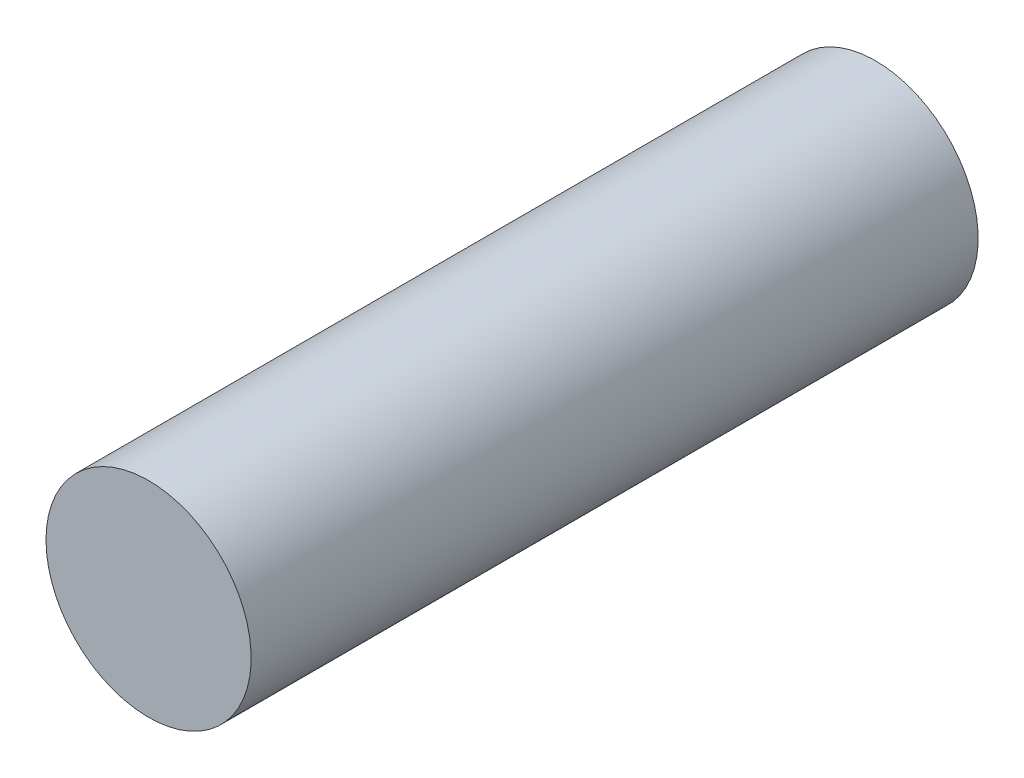
ISO-10303-21;
HEADER;
FILE_DESCRIPTION(('STEP AP214'),'2;1');
FILE_NAME('part.step','',(''),(''),'','','');
FILE_SCHEMA(('AUTOMOTIVE_DESIGN { 1 0 10303 214 1 1 1 1 }'));
ENDSEC;
DATA;
#1=APPLICATION_CONTEXT('core data for automotive mechanical design processes');
#2=APPLICATION_PROTOCOL_DEFINITION('international standard','automotive_design',2000,#1);
#3=PRODUCT_CONTEXT('',#1,'mechanical');
#4=PRODUCT('Part','Part','',(#3));
#5=PRODUCT_RELATED_PRODUCT_CATEGORY('part','',(#4));
#6=PRODUCT_DEFINITION_FORMATION('','',#4);
#7=PRODUCT_DEFINITION_CONTEXT('part definition',#1,'design');
#8=PRODUCT_DEFINITION('design','',#6,#7);
#9=PRODUCT_DEFINITION_SHAPE('','',#8);
#10=(LENGTH_UNIT() NAMED_UNIT(*) SI_UNIT(.MILLI.,.METRE.));
#11=(NAMED_UNIT(*) PLANE_ANGLE_UNIT() SI_UNIT($,.RADIAN.));
#12=(NAMED_UNIT(*) SI_UNIT($,.STERADIAN.) SOLID_ANGLE_UNIT());
#13=UNCERTAINTY_MEASURE_WITH_UNIT(LENGTH_MEASURE(1.E-05),#10,'distance_accuracy_value','');
#14=(GEOMETRIC_REPRESENTATION_CONTEXT(3) GLOBAL_UNCERTAINTY_ASSIGNED_CONTEXT((#13)) GLOBAL_UNIT_ASSIGNED_CONTEXT((#10,
#11,#12)) REPRESENTATION_CONTEXT('',''));
#15=CARTESIAN_POINT('',(0.,0.,0.));
#16=DIRECTION('',(0.,0.,1.));
#17=DIRECTION('',(1.,0.,0.));
#18=AXIS2_PLACEMENT_3D('',#15,#16,#17);
#19=CARTESIAN_POINT('',(0.,0.,34.02));
#20=DIRECTION('',(0.,0.,-1.));
#21=DIRECTION('',(-1.,0.,0.));
#22=AXIS2_PLACEMENT_3D('',#19,#20,#21);
#23=CYLINDRICAL_SURFACE('',#22,6.4);
#24=CARTESIAN_POINT('',(0.,0.,34.02));
#25=DIRECTION('',(0.,0.,1.));
#26=DIRECTION('',(1.,0.,0.));
#27=AXIS2_PLACEMENT_3D('',#24,#25,#26);
#28=CIRCLE('',#27,6.4);
#29=CARTESIAN_POINT('',(-6.4,0.,34.02));
#30=VERTEX_POINT('',#29);
#31=EDGE_CURVE('E10',#30,#30,#28,.T.);
#32=CARTESIAN_POINT('',(0.,0.,-11.34));
#33=DIRECTION('',(0.,0.,1.));
#34=DIRECTION('',(1.,0.,0.));
#35=AXIS2_PLACEMENT_3D('',#32,#33,#34);
#36=CIRCLE('',#35,6.4);
#37=CARTESIAN_POINT('',(-6.4,0.,-11.34));
#38=VERTEX_POINT('',#37);
#39=EDGE_CURVE('E36',#38,#38,#36,.T.);
#40=CARTESIAN_POINT('',(-6.4,0.,34.02));
#41=CARTESIAN_POINT('',(-6.4,0.,33.5475));
#42=CARTESIAN_POINT('',(-6.4,0.,33.075));
#43=CARTESIAN_POINT('',(-6.4,0.,32.13));
#44=CARTESIAN_POINT('',(-6.4,0.,31.6575));
#45=CARTESIAN_POINT('',(-6.4,0.,30.7125));
#46=CARTESIAN_POINT('',(-6.4,0.,30.24));
#47=CARTESIAN_POINT('',(-6.4,0.,29.295));
#48=CARTESIAN_POINT('',(-6.4,0.,28.8225));
#49=CARTESIAN_POINT('',(-6.4,0.,27.8775));
#50=CARTESIAN_POINT('',(-6.4,0.,27.405));
#51=CARTESIAN_POINT('',(-6.4,0.,26.46));
#52=CARTESIAN_POINT('',(-6.4,0.,25.9875));
#53=CARTESIAN_POINT('',(-6.4,0.,25.0425));
#54=CARTESIAN_POINT('',(-6.4,0.,24.57));
#55=CARTESIAN_POINT('',(-6.4,0.,23.625));
#56=CARTESIAN_POINT('',(-6.4,0.,23.1525));
#57=CARTESIAN_POINT('',(-6.4,0.,22.2075));
#58=CARTESIAN_POINT('',(-6.4,0.,21.735));
#59=CARTESIAN_POINT('',(-6.4,0.,20.79));
#60=CARTESIAN_POINT('',(-6.4,0.,20.3175));
#61=CARTESIAN_POINT('',(-6.4,0.,19.3725));
#62=CARTESIAN_POINT('',(-6.4,0.,18.9));
#63=CARTESIAN_POINT('',(-6.4,0.,17.955));
#64=CARTESIAN_POINT('',(-6.4,0.,17.4825));
#65=CARTESIAN_POINT('',(-6.4,0.,16.5375));
#66=CARTESIAN_POINT('',(-6.4,0.,16.065));
#67=CARTESIAN_POINT('',(-6.4,0.,15.12));
#68=CARTESIAN_POINT('',(-6.4,0.,14.6475));
#69=CARTESIAN_POINT('',(-6.4,0.,13.7025));
#70=CARTESIAN_POINT('',(-6.4,0.,13.23));
#71=CARTESIAN_POINT('',(-6.4,0.,12.285));
#72=CARTESIAN_POINT('',(-6.4,0.,11.8125));
#73=CARTESIAN_POINT('',(-6.4,0.,10.8675));
#74=CARTESIAN_POINT('',(-6.4,0.,10.395));
#75=CARTESIAN_POINT('',(-6.4,0.,9.45));
#76=CARTESIAN_POINT('',(-6.4,0.,8.9775));
#77=CARTESIAN_POINT('',(-6.4,0.,8.0325));
#78=CARTESIAN_POINT('',(-6.4,0.,7.56));
#79=CARTESIAN_POINT('',(-6.4,0.,6.615));
#80=CARTESIAN_POINT('',(-6.4,0.,6.14249999999999));
#81=CARTESIAN_POINT('',(-6.4,0.,5.19749999999999));
#82=CARTESIAN_POINT('',(-6.4,0.,4.725));
#83=CARTESIAN_POINT('',(-6.4,0.,3.78));
#84=CARTESIAN_POINT('',(-6.4,0.,3.3075));
#85=CARTESIAN_POINT('',(-6.4,0.,2.3625));
#86=CARTESIAN_POINT('',(-6.4,0.,1.89));
#87=CARTESIAN_POINT('',(-6.4,0.,0.945000000000004));
#88=CARTESIAN_POINT('',(-6.4,0.,0.472500000000005));
#89=CARTESIAN_POINT('',(-6.4,0.,-0.472499999999994));
#90=CARTESIAN_POINT('',(-6.4,0.,-0.944999999999995));
#91=CARTESIAN_POINT('',(-6.4,0.,-1.89));
#92=CARTESIAN_POINT('',(-6.4,0.,-2.3625));
#93=CARTESIAN_POINT('',(-6.4,0.,-3.3075));
#94=CARTESIAN_POINT('',(-6.4,0.,-3.78));
#95=CARTESIAN_POINT('',(-6.4,0.,-4.725));
#96=CARTESIAN_POINT('',(-6.4,0.,-5.1975));
#97=CARTESIAN_POINT('',(-6.4,0.,-6.14249999999999));
#98=CARTESIAN_POINT('',(-6.4,0.,-6.615));
#99=CARTESIAN_POINT('',(-6.4,0.,-7.56));
#100=CARTESIAN_POINT('',(-6.4,0.,-8.0325));
#101=CARTESIAN_POINT('',(-6.4,0.,-8.9775));
#102=CARTESIAN_POINT('',(-6.4,0.,-9.45));
#103=CARTESIAN_POINT('',(-6.4,0.,-10.395));
#104=CARTESIAN_POINT('',(-6.4,0.,-10.8675));
#105=CARTESIAN_POINT('',(-6.4,0.,-11.34));
#106=B_SPLINE_CURVE_WITH_KNOTS('',3,(#40,#41,#42,#43,#44,#45,#46,#47,#48,#49,#50,#51,#52,#53,
#54,#55,#56,#57,#58,#59,#60,#61,#62,#63,#64,#65,#66,#67,#68,#69,#70,#71,#72,#73,#74,#75,#76,#77,
#78,#79,#80,#81,#82,#83,#84,#85,#86,#87,#88,#89,#90,#91,#92,#93,#94,#95,#96,#97,#98,#99,#100,
#101,#102,#103,#104,#105),.UNSPECIFIED.,.F.,.F.,(4,2,2,2,2,2,2,2,2,2,2,2,2,2,2,2,2,2,2,2,2,2,2,
2,2,2,2,2,2,2,2,2,4),(0.,1.4175,2.835,4.2525,5.67,7.0875,8.505,9.9225,11.34,12.7575,14.175,
15.5925,17.01,18.4275,19.845,21.2625,22.68,24.0975,25.515,26.9325,28.35,29.7675,31.185,32.6025,
34.02,35.4375,36.855,38.2725,39.69,41.1075,42.525,43.9425,45.36),.UNSPECIFIED.);
#107=EDGE_CURVE('BSEAM33',#30,#38,#106,.T.);
#108=ORIENTED_EDGE('',*,*,#31,.F.);
#109=ORIENTED_EDGE('',*,*,#39,.T.);
#110=ORIENTED_EDGE('',*,*,#107,.T.);
#111=ORIENTED_EDGE('',*,*,#107,.F.);
#112=EDGE_LOOP('',(#108,#110,#109,#111));
#113=FACE_BOUND('',#112,.T.);
#114=ADVANCED_FACE('F33',(#113),#23,.T.);
#115=CARTESIAN_POINT('',(0.,0.,34.02));
#116=DIRECTION('',(0.,0.,1.));
#117=DIRECTION('',(1.,0.,0.));
#118=AXIS2_PLACEMENT_3D('',#115,#116,#117);
#119=PLANE('',#118);
#120=ORIENTED_EDGE('',*,*,#31,.T.);
#121=EDGE_LOOP('',(#120));
#122=FACE_BOUND('',#121,.T.);
#123=ADVANCED_FACE('F48',(#122),#119,.T.);
#124=CARTESIAN_POINT('',(0.,0.,-11.34));
#125=DIRECTION('',(0.,0.,1.));
#126=DIRECTION('',(1.,0.,0.));
#127=AXIS2_PLACEMENT_3D('',#124,#125,#126);
#128=PLANE('',#127);
#129=ORIENTED_EDGE('',*,*,#39,.F.);
#130=EDGE_LOOP('',(#129));
#131=FACE_BOUND('',#130,.T.);
#132=ADVANCED_FACE('F46',(#131),#128,.F.);
#133=CLOSED_SHELL('',(#114,#123,#132));
#134=MANIFOLD_SOLID_BREP('B2',#133);
#135=ADVANCED_BREP_SHAPE_REPRESENTATION('',(#18,#134),#14);
#136=SHAPE_DEFINITION_REPRESENTATION(#9,#135);
ENDSEC;
END-ISO-10303-21;
